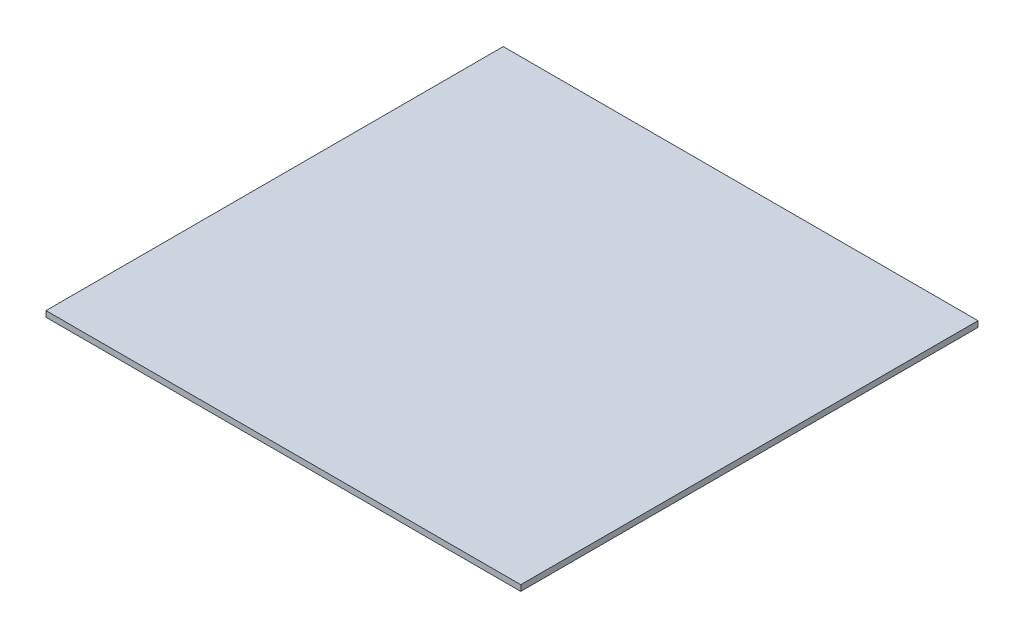
ISO-10303-21;
HEADER;
FILE_DESCRIPTION(('STEP AP214'),'2;1');
FILE_NAME('part.step','',(''),(''),'','','');
FILE_SCHEMA(('AUTOMOTIVE_DESIGN { 1 0 10303 214 1 1 1 1 }'));
ENDSEC;
DATA;
#1=APPLICATION_CONTEXT('core data for automotive mechanical design processes');
#2=APPLICATION_PROTOCOL_DEFINITION('international standard','automotive_design',2000,#1);
#3=PRODUCT_CONTEXT('',#1,'mechanical');
#4=PRODUCT('Part','Part','',(#3));
#5=PRODUCT_RELATED_PRODUCT_CATEGORY('part','',(#4));
#6=PRODUCT_DEFINITION_FORMATION('','',#4);
#7=PRODUCT_DEFINITION_CONTEXT('part definition',#1,'design');
#8=PRODUCT_DEFINITION('design','',#6,#7);
#9=PRODUCT_DEFINITION_SHAPE('','',#8);
#10=(LENGTH_UNIT() NAMED_UNIT(*) SI_UNIT(.MILLI.,.METRE.));
#11=(NAMED_UNIT(*) PLANE_ANGLE_UNIT() SI_UNIT($,.RADIAN.));
#12=(NAMED_UNIT(*) SI_UNIT($,.STERADIAN.) SOLID_ANGLE_UNIT());
#13=UNCERTAINTY_MEASURE_WITH_UNIT(LENGTH_MEASURE(1.E-05),#10,'distance_accuracy_value','');
#14=(GEOMETRIC_REPRESENTATION_CONTEXT(3) GLOBAL_UNCERTAINTY_ASSIGNED_CONTEXT((#13)) GLOBAL_UNIT_ASSIGNED_CONTEXT((#10,
#11,#12)) REPRESENTATION_CONTEXT('',''));
#15=CARTESIAN_POINT('',(0.,0.,0.));
#16=DIRECTION('',(0.,0.,1.));
#17=DIRECTION('',(1.,0.,0.));
#18=AXIS2_PLACEMENT_3D('',#15,#16,#17);
#19=CARTESIAN_POINT('',(0.,3.,0.));
#20=DIRECTION('',(1.,0.,0.));
#21=DIRECTION('',(0.,0.,-1.));
#22=AXIS2_PLACEMENT_3D('',#19,#20,#21);
#23=PLANE('',#22);
#24=DIRECTION('',(0.,0.,1.));
#25=VECTOR('',#24,1.);
#26=CARTESIAN_POINT('',(0.,0.,0.));
#27=LINE('',#26,#25);
#28=CARTESIAN_POINT('',(0.,0.,0.));
#29=VERTEX_POINT('',#28);
#30=CARTESIAN_POINT('',(0.,0.,235.));
#31=VERTEX_POINT('',#30);
#32=EDGE_CURVE('E98',#29,#31,#27,.T.);
#33=ORIENTED_EDGE('',*,*,#32,.T.);
#34=DIRECTION('',(0.,-1.,0.));
#35=VECTOR('',#34,1.);
#36=CARTESIAN_POINT('',(0.,3.,235.));
#37=LINE('',#36,#35);
#38=CARTESIAN_POINT('',(0.,3.,235.));
#39=VERTEX_POINT('',#38);
#40=EDGE_CURVE('E11',#39,#31,#37,.T.);
#41=ORIENTED_EDGE('',*,*,#40,.F.);
#42=DIRECTION('',(0.,0.,1.));
#43=VECTOR('',#42,1.);
#44=CARTESIAN_POINT('',(0.,3.,0.));
#45=LINE('',#44,#43);
#46=CARTESIAN_POINT('',(0.,3.,0.));
#47=VERTEX_POINT('',#46);
#48=EDGE_CURVE('E86',#47,#39,#45,.T.);
#49=ORIENTED_EDGE('',*,*,#48,.F.);
#50=DIRECTION('',(0.,-1.,0.));
#51=VECTOR('',#50,1.);
#52=CARTESIAN_POINT('',(0.,3.,0.));
#53=LINE('',#52,#51);
#54=EDGE_CURVE('E94',#47,#29,#53,.T.);
#55=ORIENTED_EDGE('',*,*,#54,.T.);
#56=EDGE_LOOP('',(#33,#41,#49,#55));
#57=FACE_BOUND('',#56,.T.);
#58=ADVANCED_FACE('F35',(#57),#23,.F.);
#59=CARTESIAN_POINT('',(0.,3.,235.));
#60=DIRECTION('',(0.,0.,-1.));
#61=DIRECTION('',(-1.,0.,0.));
#62=AXIS2_PLACEMENT_3D('',#59,#60,#61);
#63=PLANE('',#62);
#64=DIRECTION('',(1.,0.,0.));
#65=VECTOR('',#64,1.);
#66=CARTESIAN_POINT('',(0.,0.,235.));
#67=LINE('',#66,#65);
#68=CARTESIAN_POINT('',(244.,0.,235.));
#69=VERTEX_POINT('',#68);
#70=EDGE_CURVE('E90',#31,#69,#67,.T.);
#71=ORIENTED_EDGE('',*,*,#70,.T.);
#72=DIRECTION('',(0.,-1.,0.));
#73=VECTOR('',#72,1.);
#74=CARTESIAN_POINT('',(244.,3.,235.));
#75=LINE('',#74,#73);
#76=CARTESIAN_POINT('',(244.,3.,235.));
#77=VERTEX_POINT('',#76);
#78=EDGE_CURVE('E43',#77,#69,#75,.T.);
#79=ORIENTED_EDGE('',*,*,#78,.F.);
#80=DIRECTION('',(1.,0.,0.));
#81=VECTOR('',#80,1.);
#82=CARTESIAN_POINT('',(0.,3.,235.));
#83=LINE('',#82,#81);
#84=EDGE_CURVE('E81',#39,#77,#83,.T.);
#85=ORIENTED_EDGE('',*,*,#84,.F.);
#86=ORIENTED_EDGE('',*,*,#40,.T.);
#87=EDGE_LOOP('',(#71,#79,#85,#86));
#88=FACE_BOUND('',#87,.T.);
#89=ADVANCED_FACE('F89',(#88),#63,.F.);
#90=CARTESIAN_POINT('',(244.,3.,0.));
#91=DIRECTION('',(-1.,0.,0.));
#92=DIRECTION('',(0.,0.,1.));
#93=AXIS2_PLACEMENT_3D('',#90,#91,#92);
#94=PLANE('',#93);
#95=DIRECTION('',(0.,0.,-1.));
#96=VECTOR('',#95,1.);
#97=CARTESIAN_POINT('',(244.,0.,0.));
#98=LINE('',#97,#96);
#99=CARTESIAN_POINT('',(244.,0.,0.));
#100=VERTEX_POINT('',#99);
#101=EDGE_CURVE('E68',#69,#100,#98,.T.);
#102=ORIENTED_EDGE('',*,*,#101,.T.);
#103=DIRECTION('',(0.,-1.,0.));
#104=VECTOR('',#103,1.);
#105=CARTESIAN_POINT('',(244.,3.,0.));
#106=LINE('',#105,#104);
#107=CARTESIAN_POINT('',(244.,3.,0.));
#108=VERTEX_POINT('',#107);
#109=EDGE_CURVE('E91',#108,#100,#106,.T.);
#110=ORIENTED_EDGE('',*,*,#109,.F.);
#111=DIRECTION('',(0.,0.,-1.));
#112=VECTOR('',#111,1.);
#113=CARTESIAN_POINT('',(244.,3.,0.));
#114=LINE('',#113,#112);
#115=EDGE_CURVE('E84',#77,#108,#114,.T.);
#116=ORIENTED_EDGE('',*,*,#115,.F.);
#117=ORIENTED_EDGE('',*,*,#78,.T.);
#118=EDGE_LOOP('',(#102,#110,#116,#117));
#119=FACE_BOUND('',#118,.T.);
#120=ADVANCED_FACE('F92',(#119),#94,.F.);
#121=CARTESIAN_POINT('',(0.,3.,0.));
#122=DIRECTION('',(0.,0.,1.));
#123=DIRECTION('',(1.,0.,0.));
#124=AXIS2_PLACEMENT_3D('',#121,#122,#123);
#125=PLANE('',#124);
#126=DIRECTION('',(-1.,0.,0.));
#127=VECTOR('',#126,1.);
#128=CARTESIAN_POINT('',(0.,0.,0.));
#129=LINE('',#128,#127);
#130=EDGE_CURVE('E74',#100,#29,#129,.T.);
#131=ORIENTED_EDGE('',*,*,#130,.T.);
#132=ORIENTED_EDGE('',*,*,#54,.F.);
#133=DIRECTION('',(-1.,0.,0.));
#134=VECTOR('',#133,1.);
#135=CARTESIAN_POINT('',(0.,3.,0.));
#136=LINE('',#135,#134);
#137=EDGE_CURVE('E51',#108,#47,#136,.T.);
#138=ORIENTED_EDGE('',*,*,#137,.F.);
#139=ORIENTED_EDGE('',*,*,#109,.T.);
#140=EDGE_LOOP('',(#131,#132,#138,#139));
#141=FACE_BOUND('',#140,.T.);
#142=ADVANCED_FACE('F105',(#141),#125,.F.);
#143=CARTESIAN_POINT('',(0.,3.,0.));
#144=DIRECTION('',(0.,1.,0.));
#145=DIRECTION('',(0.,0.,1.));
#146=AXIS2_PLACEMENT_3D('',#143,#144,#145);
#147=PLANE('',#146);
#148=ORIENTED_EDGE('',*,*,#48,.T.);
#149=ORIENTED_EDGE('',*,*,#84,.T.);
#150=ORIENTED_EDGE('',*,*,#115,.T.);
#151=ORIENTED_EDGE('',*,*,#137,.T.);
#152=EDGE_LOOP('',(#148,#149,#150,#151));
#153=FACE_BOUND('',#152,.T.);
#154=ADVANCED_FACE('F82',(#153),#147,.T.);
#155=CARTESIAN_POINT('',(0.,0.,0.));
#156=DIRECTION('',(0.,1.,0.));
#157=DIRECTION('',(0.,0.,1.));
#158=AXIS2_PLACEMENT_3D('',#155,#156,#157);
#159=PLANE('',#158);
#160=ORIENTED_EDGE('',*,*,#32,.F.);
#161=ORIENTED_EDGE('',*,*,#130,.F.);
#162=ORIENTED_EDGE('',*,*,#101,.F.);
#163=ORIENTED_EDGE('',*,*,#70,.F.);
#164=EDGE_LOOP('',(#160,#161,#162,#163));
#165=FACE_BOUND('',#164,.T.);
#166=ADVANCED_FACE('F108',(#165),#159,.F.);
#167=CLOSED_SHELL('',(#58,#89,#120,#142,#154,#166));
#168=MANIFOLD_SOLID_BREP('B2',#167);
#169=ADVANCED_BREP_SHAPE_REPRESENTATION('',(#18,#168),#14);
#170=SHAPE_DEFINITION_REPRESENTATION(#9,#169);
ENDSEC;
END-ISO-10303-21;
